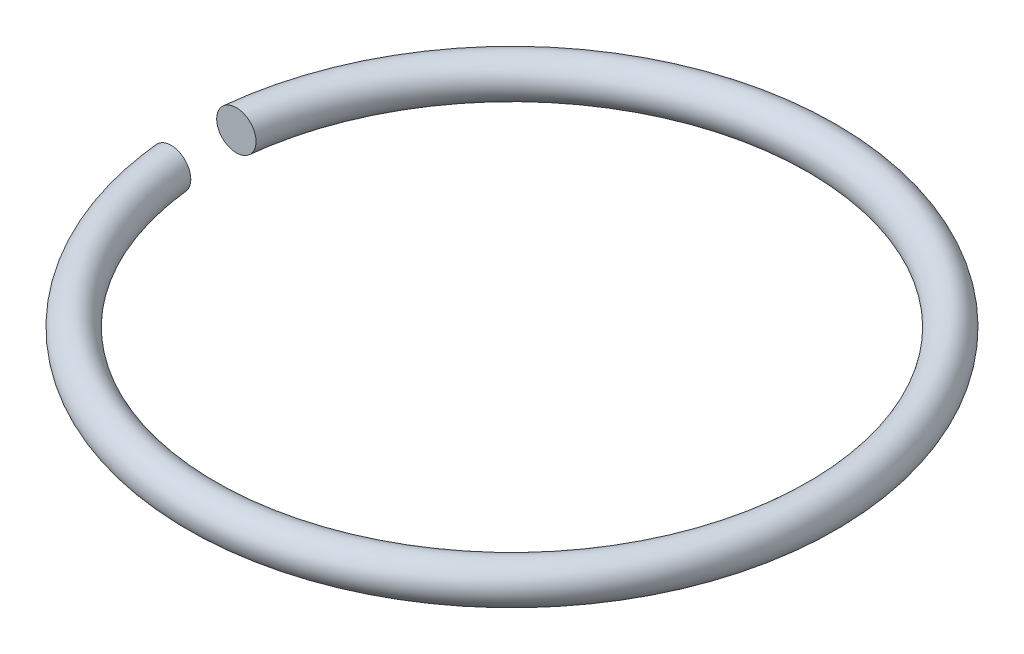
ISO-10303-21;
HEADER;
FILE_DESCRIPTION(('STEP AP214'),'2;1');
FILE_NAME('part.step','',(''),(''),'','','');
FILE_SCHEMA(('AUTOMOTIVE_DESIGN { 1 0 10303 214 1 1 1 1 }'));
ENDSEC;
DATA;
#1=APPLICATION_CONTEXT('core data for automotive mechanical design processes');
#2=APPLICATION_PROTOCOL_DEFINITION('international standard','automotive_design',2000,#1);
#3=PRODUCT_CONTEXT('',#1,'mechanical');
#4=PRODUCT('Part','Part','',(#3));
#5=PRODUCT_RELATED_PRODUCT_CATEGORY('part','',(#4));
#6=PRODUCT_DEFINITION_FORMATION('','',#4);
#7=PRODUCT_DEFINITION_CONTEXT('part definition',#1,'design');
#8=PRODUCT_DEFINITION('design','',#6,#7);
#9=PRODUCT_DEFINITION_SHAPE('','',#8);
#10=(LENGTH_UNIT() NAMED_UNIT(*) SI_UNIT(.MILLI.,.METRE.));
#11=(NAMED_UNIT(*) PLANE_ANGLE_UNIT() SI_UNIT($,.RADIAN.));
#12=(NAMED_UNIT(*) SI_UNIT($,.STERADIAN.) SOLID_ANGLE_UNIT());
#13=UNCERTAINTY_MEASURE_WITH_UNIT(LENGTH_MEASURE(1.E-05),#10,'distance_accuracy_value','');
#14=(GEOMETRIC_REPRESENTATION_CONTEXT(3) GLOBAL_UNCERTAINTY_ASSIGNED_CONTEXT((#13)) GLOBAL_UNIT_ASSIGNED_CONTEXT((#10,
#11,#12)) REPRESENTATION_CONTEXT('',''));
#15=CARTESIAN_POINT('',(0.,0.,0.));
#16=DIRECTION('',(0.,0.,1.));
#17=DIRECTION('',(1.,0.,0.));
#18=AXIS2_PLACEMENT_3D('',#15,#16,#17);
#19=CARTESIAN_POINT('',(0.,0.600000000000003,0.));
#20=DIRECTION('',(0.,-1.,0.));
#21=DIRECTION('',(0.,0.,-1.));
#22=AXIS2_PLACEMENT_3D('',#19,#20,#21);
#23=TOROIDAL_SURFACE('',#22,9.5,0.6);
#24=CARTESIAN_POINT('',(-9.95459745438175,0.275533521387379,-1.));
#25=CARTESIAN_POINT('',(-9.97282599426007,0.303748273295086,-1.00000000000002));
#26=CARTESIAN_POINT('',(-9.98869080773676,0.333518507680138,-0.999999999999975));
#27=CARTESIAN_POINT('',(-10.0152122632438,0.395323441963801,-0.999999999999915));
#28=CARTESIAN_POINT('',(-10.0258628859101,0.42736071038891,-0.999999999999903));
#29=CARTESIAN_POINT('',(-10.0416250877267,0.492761139812391,-0.999999999999905));
#30=CARTESIAN_POINT('',(-10.0467386743456,0.526123815729434,-0.99999999999992));
#31=CARTESIAN_POINT('',(-10.0512808721673,0.593225215681483,-0.999999999999971));
#32=CARTESIAN_POINT('',(-10.0507108575396,0.626963846848369,-1.00000000000001));
#33=CARTESIAN_POINT('',(-10.0439113604549,0.69381824987743,-0.999999999999995));
#34=CARTESIAN_POINT('',(-10.0376897663872,0.726934824254974,-0.999999999999947));
#35=CARTESIAN_POINT('',(-10.0197790205441,0.791655727422509,-0.999999999999943));
#36=CARTESIAN_POINT('',(-10.0080896701128,0.823260001221195,-0.999999999999987));
#37=CARTESIAN_POINT('',(-9.97957130197109,0.884087427453508,-0.999999999999987));
#38=CARTESIAN_POINT('',(-9.96273826236725,0.913308693861951,-0.999999999999942));
#39=CARTESIAN_POINT('',(-9.92442148155778,0.968523260347564,-0.999999999999949));
#40=CARTESIAN_POINT('',(-9.90293767916021,0.994516517945455,-1.));
#41=CARTESIAN_POINT('',(-9.85585144688647,1.04263734424777,-1.));
#42=CARTESIAN_POINT('',(-9.83023484455429,1.06475104377707,-0.999999999999949));
#43=CARTESIAN_POINT('',(-9.77566827089695,1.10438909592548,-0.999999999999942));
#44=CARTESIAN_POINT('',(-9.74671822049596,1.12191333964151,-0.999999999999987));
#45=CARTESIAN_POINT('',(-9.68615353967069,1.15196717803399,-0.999999999999987));
#46=CARTESIAN_POINT('',(-9.65452644541865,1.16447165565467,-0.999999999999942));
#47=CARTESIAN_POINT('',(-9.58962746640092,1.18402016116665,-0.999999999999949));
#48=CARTESIAN_POINT('',(-9.55635553598833,1.19106403742674,-1.));
#49=CARTESIAN_POINT('',(-9.48895182328815,1.19952000751403,-1.));
#50=CARTESIAN_POINT('',(-9.45481685729975,1.20090673621885,-0.999999999999945));
#51=CARTESIAN_POINT('',(-9.38679665730078,1.19794270818148,-0.999999999999946));
#52=CARTESIAN_POINT('',(-9.35291142742363,1.19359185668896,-1.));
#53=CARTESIAN_POINT('',(-9.28627999096113,1.17925852330123,-1.));
#54=CARTESIAN_POINT('',(-9.25353627738464,1.16926444630622,-0.999999999999945));
#55=CARTESIAN_POINT('',(-9.1901949819072,1.1439128149258,-0.999999999999945));
#56=CARTESIAN_POINT('',(-9.15959739546093,1.12855527190021,-1.));
#57=CARTESIAN_POINT('',(-9.1014720291695,1.09293115998834,-1.));
#58=CARTESIAN_POINT('',(-9.07393957734739,1.07267221580916,-0.999999999999946));
#59=CARTESIAN_POINT('',(-9.0226872878016,1.02779903320501,-0.999999999999945));
#60=CARTESIAN_POINT('',(-8.99896736144527,1.00318489605642,-1.));
#61=CARTESIAN_POINT('',(-8.9561383346076,0.950424098209453,-1.));
#62=CARTESIAN_POINT('',(-8.93700763342676,0.922294973840553,-0.999999999999949));
#63=CARTESIAN_POINT('',(-8.90377352632721,0.863208833706965,-0.999999999999942));
#64=CARTESIAN_POINT('',(-8.8896699474294,0.832251915290372,-0.999999999999987));
#65=CARTESIAN_POINT('',(-8.86697748053738,0.768587671162954,-0.999999999999987));
#66=CARTESIAN_POINT('',(-8.85835614415634,0.735891909957683,-0.999999999999941));
#67=CARTESIAN_POINT('',(-8.84675086210338,0.669514951841421,-0.999999999999949));
#68=CARTESIAN_POINT('',(-8.843766757373,0.635833782761641,-1.));
#69=CARTESIAN_POINT('',(-8.84352501767759,0.568592570526096,-1.));
#70=CARTESIAN_POINT('',(-8.84624345616879,0.535032610739716,-0.999999999999945));
#71=CARTESIAN_POINT('',(-8.85727776451554,0.468846302768397,-0.999999999999946));
#72=CARTESIAN_POINT('',(-8.8655935964208,0.436219948255186,-1.));
#73=CARTESIAN_POINT('',(-8.88757546903483,0.372830861609439,-1.));
#74=CARTESIAN_POINT('',(-8.9012403722614,0.342067734865714,-0.999999999999945));
#75=CARTESIAN_POINT('',(-8.93352178230539,0.283260149563326,-0.999999999999945));
#76=CARTESIAN_POINT('',(-8.95213836516496,0.25521573276448,-1.));
#77=CARTESIAN_POINT('',(-8.99386690437798,0.202522598122965,-1.));
#78=CARTESIAN_POINT('',(-9.01699589772171,0.177887374178695,-0.999999999999946));
#79=CARTESIAN_POINT('',(-9.06703994028429,0.132821537323193,-0.999999999999945));
#80=CARTESIAN_POINT('',(-9.09395511271983,0.112391061303786,-1.));
#81=CARTESIAN_POINT('',(-9.15097749571418,0.0761869916299208,-1.));
#82=CARTESIAN_POINT('',(-9.18110259798097,0.0604415772693057,-0.99999999999995));
#83=CARTESIAN_POINT('',(-9.24355919193911,0.0342023549261636,-0.999999999999941));
#84=CARTESIAN_POINT('',(-9.27589075394933,0.0237087144041971,-0.999999999999985));
#85=CARTESIAN_POINT('',(-9.34201901951272,0.00822072974984676,-0.999999999999989));
#86=CARTESIAN_POINT('',(-9.37582232992476,0.00325458446743322,-0.999999999999949));
#87=CARTESIAN_POINT('',(-9.44378219924226,-0.000944616614611835,-0.999999999999941));
#88=CARTESIAN_POINT('',(-9.47793875005882,-0.000177803405047661,-0.999999999999973));
#89=CARTESIAN_POINT('',(-9.54570498266042,0.00707635967287051,-0.999999999999973));
#90=CARTESIAN_POINT('',(-9.57931350156664,0.0135745802075637,-0.999999999999941));
#91=CARTESIAN_POINT('',(-9.64496852112791,0.0321327179667931,-0.99999999999995));
#92=CARTESIAN_POINT('',(-9.67701463922523,0.0441939898312682,-0.99999999999999));
#93=CARTESIAN_POINT('',(-9.73857826151399,0.0735246677578593,-0.999999999999984));
#94=CARTESIAN_POINT('',(-9.76809868757531,0.0907879482988048,-0.999999999999937));
#95=CARTESIAN_POINT('',(-9.82377787370088,0.130035307947741,-0.999999999999954));
#96=CARTESIAN_POINT('',(-9.84994070073894,0.152013587971782,-1.00000000000002));
#97=CARTESIAN_POINT('',(-9.88919419179567,0.191116929974396,-0.99999999999999));
#98=CARTESIAN_POINT('',(-9.90353076483972,0.207012395641596,-0.999999999999946));
#99=CARTESIAN_POINT('',(-9.93043003872964,0.240239609727776,-0.999999999999945));
#100=CARTESIAN_POINT('',(-9.94299274283988,0.25757135550355,-0.999999999999987));
#101=CARTESIAN_POINT('',(-9.95459745438175,0.275533521387379,-1.));
#102=B_SPLINE_CURVE_WITH_KNOTS('',3,(#24,#25,#26,#27,#28,#29,#30,#31,#32,#33,#34,#35,#36,#37,
#38,#39,#40,#41,#42,#43,#44,#45,#46,#47,#48,#49,#50,#51,#52,#53,#54,#55,#56,#57,#58,#59,#60,#61,
#62,#63,#64,#65,#66,#67,#68,#69,#70,#71,#72,#73,#74,#75,#76,#77,#78,#79,#80,#81,#82,#83,#84,#85,
#86,#87,#88,#89,#90,#91,#92,#93,#94,#95,#96,#97,#98,#99,#100,#101),.UNSPECIFIED.,.T.,.F.,(4,2,2,
2,2,2,2,2,2,2,2,2,2,2,2,2,2,2,2,2,2,2,2,2,2,2,2,2,2,2,2,2,2,2,2,2,2,2,4),(0.,0.100695105121135,
0.201506182133289,0.302280697542032,0.403030848484101,0.503640589605981,0.60425398639208,
0.70494625581411,0.805639850164966,0.906686390681569,1.00773532871157,1.10928375812149,
1.21083500725024,1.31284108763594,1.41484885256993,1.51706697890364,1.61928488874054,
1.72134479759553,1.82340233344404,1.92496963820581,2.02653344778372,2.12749038291331,
2.22844446942904,2.32897582348526,2.42950649594675,2.5300158021231,2.63052665189381,
2.73142460115594,2.83232583478143,2.9338222312416,3.03532186385802,3.13733696290314,
3.23934973104022,3.3415564022063,3.44378797452573,3.54589963342192,3.64788641563098,
3.71199137449452,3.77609621538739),.UNSPECIFIED.);
#103=CARTESIAN_POINT('',(-9.95459745438175,0.275533521387379,-1.));
#104=VERTEX_POINT('',#103);
#105=EDGE_CURVE('E10',#104,#104,#102,.T.);
#106=ORIENTED_EDGE('',*,*,#105,.T.);
#107=EDGE_LOOP('',(#106));
#108=FACE_BOUND('',#107,.T.);
#109=CARTESIAN_POINT('',(-9.95459745438175,0.275533521387379,1.00000000000001));
#110=CARTESIAN_POINT('',(-9.93625048423838,0.247141030050075,1.00000000000003));
#111=CARTESIAN_POINT('',(-9.91548279595837,0.220282574180417,1.00000000000001));
#112=CARTESIAN_POINT('',(-9.86970943246946,0.170417247180403,0.999999999999993));
#113=CARTESIAN_POINT('',(-9.84469845568634,0.147415266707322,1.));
#114=CARTESIAN_POINT('',(-9.79118879387404,0.105945905913388,1.));
#115=CARTESIAN_POINT('',(-9.76269253877899,0.0874753929586211,0.999999999999998));
#116=CARTESIAN_POINT('',(-9.70302088851212,0.0555658165984384,1.));
#117=CARTESIAN_POINT('',(-9.67184615577356,0.042125513515245,1.00000000000001));
#118=CARTESIAN_POINT('',(-9.60757038208269,0.0205945786410987,1.00000000000002));
#119=CARTESIAN_POINT('',(-9.57446253907787,0.0125242512075325,1.00000000000001));
#120=CARTESIAN_POINT('',(-9.50736203136837,0.0020333621211834,0.999999999999993));
#121=CARTESIAN_POINT('',(-9.47336931021448,-0.000386838194425646,0.999999999999986));
#122=CARTESIAN_POINT('',(-9.40533176781154,0.000488952702675081,0.999999999999988));
#123=CARTESIAN_POINT('',(-9.37128721656784,0.00380605248353852,0.999999999999998));
#124=CARTESIAN_POINT('',(-9.30423668067367,0.0161043996817681,1.));
#125=CARTESIAN_POINT('',(-9.27123070442204,0.0250856928924939,1.));
#126=CARTESIAN_POINT('',(-9.20717431255262,0.0484719261335559,1.));
#127=CARTESIAN_POINT('',(-9.1761251979729,0.0628804310044965,1.00000000000001));
#128=CARTESIAN_POINT('',(-9.11689650512655,0.0967207204834049,0.999999999999994));
#129=CARTESIAN_POINT('',(-9.08871688905434,0.116152438898694,0.999999999999973));
#130=CARTESIAN_POINT('',(-9.03612278067078,0.15942993684085,0.999999999999973));
#131=CARTESIAN_POINT('',(-9.01169715490074,0.18326218372555,0.999999999999993));
#132=CARTESIAN_POINT('',(-8.96722116109753,0.234709587700622,1.00000000000001));
#133=CARTESIAN_POINT('',(-8.94717066834284,0.262324636918448,1.));
#134=CARTESIAN_POINT('',(-8.91213550669388,0.320388441429011,0.999999999999998));
#135=CARTESIAN_POINT('',(-8.89712301569685,0.350820408535842,0.999999999999998));
#136=CARTESIAN_POINT('',(-8.87245323195859,0.413782614535963,1.));
#137=CARTESIAN_POINT('',(-8.86279575445007,0.446312780990565,1.00000000000001));
#138=CARTESIAN_POINT('',(-8.84916202555053,0.512352328348685,0.999999999999993));
#139=CARTESIAN_POINT('',(-8.84515427782876,0.5458552092844,0.999999999999971));
#140=CARTESIAN_POINT('',(-8.84283739487795,0.613057127564635,1.00000000000003));
#141=CARTESIAN_POINT('',(-8.84452814232961,0.646756160856557,1.00000000000011));
#142=CARTESIAN_POINT('',(-8.85354540895691,0.713297361689749,1.00000000000011));
#143=CARTESIAN_POINT('',(-8.8608565634073,0.746141613320811,1.00000000000003));
#144=CARTESIAN_POINT('',(-8.88088080316515,0.81013940661905,0.999999999999971));
#145=CARTESIAN_POINT('',(-8.89359390397869,0.841292943432807,0.999999999999994));
#146=CARTESIAN_POINT('',(-8.92407491474895,0.901081622724187,1.00000000000001));
#147=CARTESIAN_POINT('',(-8.94185075904393,0.929712719076267,0.999999999999999));
#148=CARTESIAN_POINT('',(-8.98193429727127,0.983603657267312,1.));
#149=CARTESIAN_POINT('',(-9.00424209970621,1.00886341836692,1.00000000000002));
#150=CARTESIAN_POINT('',(-9.05287387548041,1.05543228510517,1.00000000000001));
#151=CARTESIAN_POINT('',(-9.07921744813813,1.07672092155796,1.));
#152=CARTESIAN_POINT('',(-9.13508715306398,1.11460431391602,1.));
#153=CARTESIAN_POINT('',(-9.1646133877421,1.13119891871694,1.00000000000001));
#154=CARTESIAN_POINT('',(-9.22619764888373,1.15932426523129,1.00000000000002));
#155=CARTESIAN_POINT('',(-9.25826958241238,1.17082455899396,1.));
#156=CARTESIAN_POINT('',(-9.32388479690637,1.18830182977616,0.999999999999997));
#157=CARTESIAN_POINT('',(-9.35742811599781,1.1942786635848,1.));
#158=CARTESIAN_POINT('',(-9.42517753636992,1.20055676061965,1.));
#159=CARTESIAN_POINT('',(-9.45938575087931,1.20083524344254,0.999999999999994));
#160=CARTESIAN_POINT('',(-9.527364270277,1.19564855730021,1.00000000000001));
#161=CARTESIAN_POINT('',(-9.56113457214334,1.19018334871987,1.00000000000003));
#162=CARTESIAN_POINT('',(-9.62729364985421,1.17365348923002,1.00000000000003));
#163=CARTESIAN_POINT('',(-9.65968175431,1.16258614996578,1.));
#164=CARTESIAN_POINT('',(-9.72213225518054,1.13515541812981,0.999999999999997));
#165=CARTESIAN_POINT('',(-9.75219467426565,1.11879207719059,1.00000000000001));
#166=CARTESIAN_POINT('',(-9.80904319491082,1.08128080910636,1.00000000000002));
#167=CARTESIAN_POINT('',(-9.83583863575083,1.06014703773838,1.00000000000001));
#168=CARTESIAN_POINT('',(-9.88547945416071,1.01366082565078,0.999999999999997));
#169=CARTESIAN_POINT('',(-9.90832492227922,0.988308481663303,1.));
#170=CARTESIAN_POINT('',(-9.94929902898618,0.934235424944708,1.));
#171=CARTESIAN_POINT('',(-9.96744989713248,0.905531556990533,1.));
#172=CARTESIAN_POINT('',(-9.99864768979439,0.845473869259499,1.));
#173=CARTESIAN_POINT('',(-10.0116949552332,0.814120226659103,1.));
#174=CARTESIAN_POINT('',(-10.0322536216036,0.749814543958871,1.));
#175=CARTESIAN_POINT('',(-10.0397913551558,0.716870920001629,0.999999999999999));
#176=CARTESIAN_POINT('',(-10.0492133756875,0.650175791391607,1.));
#177=CARTESIAN_POINT('',(-10.0510963501849,0.616424101016848,1.00000000000001));
#178=CARTESIAN_POINT('',(-10.0491540303509,0.54916644666318,0.999999999999992));
#179=CARTESIAN_POINT('',(-10.0453418023061,0.515660096900514,0.999999999999967));
#180=CARTESIAN_POINT('',(-10.0321450041022,0.449792710866061,1.00000000000003));
#181=CARTESIAN_POINT('',(-10.0227672297894,0.417430328723354,1.00000000000013));
#182=CARTESIAN_POINT('',(-10.0033414709783,0.366764477216738,1.00000000000008));
#183=CARTESIAN_POINT('',(-9.99492287788124,0.347819668950597,1.00000000000002));
#184=CARTESIAN_POINT('',(-9.9761716009118,0.310902446294015,0.999999999999982));
#185=CARTESIAN_POINT('',(-9.9658389204312,0.292930030180584,1.00000000000001));
#186=CARTESIAN_POINT('',(-9.95459745438175,0.275533521387379,1.00000000000001));
#187=B_SPLINE_CURVE_WITH_KNOTS('',3,(#109,#110,#111,#112,#113,#114,#115,#116,#117,#118,#119,
#120,#121,#122,#123,#124,#125,#126,#127,#128,#129,#130,#131,#132,#133,#134,#135,#136,#137,#138,
#139,#140,#141,#142,#143,#144,#145,#146,#147,#148,#149,#150,#151,#152,#153,#154,#155,#156,#157,
#158,#159,#160,#161,#162,#163,#164,#165,#166,#167,#168,#169,#170,#171,#172,#173,#174,#175,#176,
#177,#178,#179,#180,#181,#182,#183,#184,#185,#186),.UNSPECIFIED.,.T.,.F.,(4,2,2,2,2,2,2,2,2,2,2,
2,2,2,2,2,2,2,2,2,2,2,2,2,2,2,2,2,2,2,2,2,2,2,2,2,2,2,4),(0.,0.101337447098368,
0.202802450615478,0.30419711178356,0.405566768108806,0.507317566525327,0.609074871935079,
0.711207357769638,0.813340669326284,0.915541184027724,1.01774035206513,1.11963031586293,
1.22151737471314,1.32283213443815,1.42414339822083,1.52488760391317,1.6256297355198,
1.72609743953811,1.82656543194698,1.9271917526069,2.02782048271189,2.12895437716408,
2.23009152682066,2.33182526067965,2.43356163219161,2.53570463796773,2.63784834824434,
2.7400411218578,2.84223289918915,2.94412532869866,3.04601542212983,3.14741383440119,
3.24880547205125,3.34970928520719,3.45063651655395,3.55133254971812,3.65190587958499,
3.71399697586892,3.77608796212948),.UNSPECIFIED.);
#188=CARTESIAN_POINT('',(-9.95459745438175,0.275533521387379,1.00000000000001));
#189=VERTEX_POINT('',#188);
#190=EDGE_CURVE('E50',#189,#189,#187,.T.);
#191=ORIENTED_EDGE('',*,*,#190,.T.);
#192=EDGE_LOOP('',(#191));
#193=FACE_BOUND('',#192,.T.);
#194=ADVANCED_FACE('F38',(#108,#193),#23,.T.);
#195=CARTESIAN_POINT('',(-12.1619974968585,-1.1999999972867E-05,1.));
#196=DIRECTION('',(0.,0.,1.));
#197=DIRECTION('',(1.,0.,0.));
#198=AXIS2_PLACEMENT_3D('',#195,#196,#197);
#199=PLANE('',#198);
#200=ORIENTED_EDGE('',*,*,#190,.F.);
#201=EDGE_LOOP('',(#200));
#202=FACE_BOUND('',#201,.T.);
#203=ADVANCED_FACE('F62',(#202),#199,.F.);
#204=CARTESIAN_POINT('',(-12.1619974968585,-1.1999999972867E-05,-0.999999999999945));
#205=DIRECTION('',(0.,0.,-1.));
#206=DIRECTION('',(-1.,0.,0.));
#207=AXIS2_PLACEMENT_3D('',#204,#205,#206);
#208=PLANE('',#207);
#209=ORIENTED_EDGE('',*,*,#105,.F.);
#210=EDGE_LOOP('',(#209));
#211=FACE_BOUND('',#210,.T.);
#212=ADVANCED_FACE('F65',(#211),#208,.F.);
#213=CLOSED_SHELL('',(#194,#203,#212));
#214=MANIFOLD_SOLID_BREP('B2',#213);
#215=ADVANCED_BREP_SHAPE_REPRESENTATION('',(#18,#214),#14);
#216=SHAPE_DEFINITION_REPRESENTATION(#9,#215);
ENDSEC;
END-ISO-10303-21;
